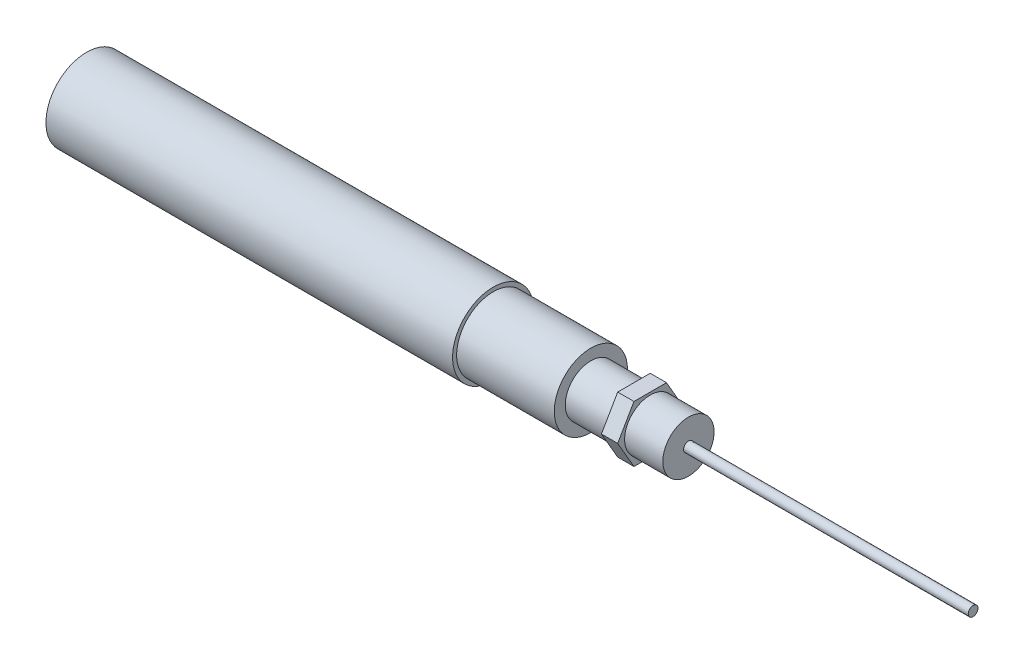
ISO-10303-21;
HEADER;
FILE_DESCRIPTION(('STEP AP214'),'2;1');
FILE_NAME('part.step','',(''),(''),'','','');
FILE_SCHEMA(('AUTOMOTIVE_DESIGN { 1 0 10303 214 1 1 1 1 }'));
ENDSEC;
DATA;
#1=APPLICATION_CONTEXT('core data for automotive mechanical design processes');
#2=APPLICATION_PROTOCOL_DEFINITION('international standard','automotive_design',2000,#1);
#3=PRODUCT_CONTEXT('',#1,'mechanical');
#4=PRODUCT('Part','Part','',(#3));
#5=PRODUCT_RELATED_PRODUCT_CATEGORY('part','',(#4));
#6=PRODUCT_DEFINITION_FORMATION('','',#4);
#7=PRODUCT_DEFINITION_CONTEXT('part definition',#1,'design');
#8=PRODUCT_DEFINITION('design','',#6,#7);
#9=PRODUCT_DEFINITION_SHAPE('','',#8);
#10=(LENGTH_UNIT() NAMED_UNIT(*) SI_UNIT(.MILLI.,.METRE.));
#11=(NAMED_UNIT(*) PLANE_ANGLE_UNIT() SI_UNIT($,.RADIAN.));
#12=(NAMED_UNIT(*) SI_UNIT($,.STERADIAN.) SOLID_ANGLE_UNIT());
#13=UNCERTAINTY_MEASURE_WITH_UNIT(LENGTH_MEASURE(1.E-05),#10,'distance_accuracy_value','');
#14=(GEOMETRIC_REPRESENTATION_CONTEXT(3) GLOBAL_UNCERTAINTY_ASSIGNED_CONTEXT((#13)) GLOBAL_UNIT_ASSIGNED_CONTEXT((#10,
#11,#12)) REPRESENTATION_CONTEXT('',''));
#15=CARTESIAN_POINT('',(0.,0.,0.));
#16=DIRECTION('',(0.,0.,1.));
#17=DIRECTION('',(1.,0.,0.));
#18=AXIS2_PLACEMENT_3D('',#15,#16,#17);
#19=CARTESIAN_POINT('',(45.,0.,0.));
#20=DIRECTION('',(-1.,0.,0.));
#21=DIRECTION('',(0.,0.,1.));
#22=AXIS2_PLACEMENT_3D('',#19,#20,#21);
#23=CYLINDRICAL_SURFACE('',#22,0.6);
#24=CARTESIAN_POINT('',(45.,0.,0.));
#25=DIRECTION('',(1.,0.,0.));
#26=DIRECTION('',(0.,0.,-1.));
#27=AXIS2_PLACEMENT_3D('',#24,#25,#26);
#28=CIRCLE('',#27,0.6);
#29=CARTESIAN_POINT('',(45.,0.,-0.6));
#30=VERTEX_POINT('',#29);
#31=EDGE_CURVE('E11',#30,#30,#28,.T.);
#32=ORIENTED_EDGE('',*,*,#31,.F.);
#33=EDGE_LOOP('',(#32));
#34=FACE_BOUND('',#33,.T.);
#35=CARTESIAN_POINT('',(10.,0.,0.));
#36=DIRECTION('',(1.,0.,0.));
#37=DIRECTION('',(0.,0.,-1.));
#38=AXIS2_PLACEMENT_3D('',#35,#36,#37);
#39=CIRCLE('',#38,0.6);
#40=CARTESIAN_POINT('',(10.,0.,-0.6));
#41=VERTEX_POINT('',#40);
#42=EDGE_CURVE('E60',#41,#41,#39,.T.);
#43=ORIENTED_EDGE('',*,*,#42,.T.);
#44=EDGE_LOOP('',(#43));
#45=FACE_BOUND('',#44,.T.);
#46=ADVANCED_FACE('F53',(#34,#45),#23,.T.);
#47=CARTESIAN_POINT('',(45.,0.,0.));
#48=DIRECTION('',(1.,0.,0.));
#49=DIRECTION('',(0.,0.,-1.));
#50=AXIS2_PLACEMENT_3D('',#47,#48,#49);
#51=PLANE('',#50);
#52=ORIENTED_EDGE('',*,*,#31,.T.);
#53=EDGE_LOOP('',(#52));
#54=FACE_BOUND('',#53,.T.);
#55=ADVANCED_FACE('F68',(#54),#51,.T.);
#56=CARTESIAN_POINT('',(10.,0.,0.));
#57=DIRECTION('',(1.,0.,0.));
#58=DIRECTION('',(0.,0.,-1.));
#59=AXIS2_PLACEMENT_3D('',#56,#57,#58);
#60=PLANE('',#59);
#61=ORIENTED_EDGE('',*,*,#42,.F.);
#62=EDGE_LOOP('',(#61));
#63=FACE_BOUND('',#62,.T.);
#64=ADVANCED_FACE('F70',(#63),#60,.F.);
#65=CLOSED_SHELL('',(#46,#55,#64));
#66=MANIFOLD_SOLID_BREP('B2',#65);
#67=CARTESIAN_POINT('',(-14.,0.,0.));
#68=DIRECTION('',(-1.,0.,0.));
#69=DIRECTION('',(0.,0.,1.));
#70=AXIS2_PLACEMENT_3D('',#67,#68,#69);
#71=CYLINDRICAL_SURFACE('',#70,5.);
#72=CARTESIAN_POINT('',(-14.,0.,0.));
#73=DIRECTION('',(1.,0.,0.));
#74=DIRECTION('',(0.,0.,-1.));
#75=AXIS2_PLACEMENT_3D('',#72,#73,#74);
#76=CIRCLE('',#75,5.);
#77=CARTESIAN_POINT('',(-14.,0.,-5.));
#78=VERTEX_POINT('',#77);
#79=EDGE_CURVE('E52',#78,#78,#76,.T.);
#80=ORIENTED_EDGE('',*,*,#79,.F.);
#81=EDGE_LOOP('',(#80));
#82=FACE_BOUND('',#81,.T.);
#83=CARTESIAN_POINT('',(-64.,0.,0.));
#84=DIRECTION('',(1.,0.,0.));
#85=DIRECTION('',(0.,0.,-1.));
#86=AXIS2_PLACEMENT_3D('',#83,#84,#85);
#87=CIRCLE('',#86,5.);
#88=CARTESIAN_POINT('',(-64.,0.,-5.));
#89=VERTEX_POINT('',#88);
#90=EDGE_CURVE('E120',#89,#89,#87,.T.);
#91=ORIENTED_EDGE('',*,*,#90,.T.);
#92=EDGE_LOOP('',(#91));
#93=FACE_BOUND('',#92,.T.);
#94=ADVANCED_FACE('F113',(#82,#93),#71,.T.);
#95=CARTESIAN_POINT('',(-14.,0.,0.));
#96=DIRECTION('',(1.,0.,0.));
#97=DIRECTION('',(0.,0.,-1.));
#98=AXIS2_PLACEMENT_3D('',#95,#96,#97);
#99=PLANE('',#98);
#100=ORIENTED_EDGE('',*,*,#79,.T.);
#101=EDGE_LOOP('',(#100));
#102=FACE_BOUND('',#101,.T.);
#103=ADVANCED_FACE('F128',(#102),#99,.T.);
#104=CARTESIAN_POINT('',(-64.,0.,0.));
#105=DIRECTION('',(1.,0.,0.));
#106=DIRECTION('',(0.,0.,-1.));
#107=AXIS2_PLACEMENT_3D('',#104,#105,#106);
#108=PLANE('',#107);
#109=ORIENTED_EDGE('',*,*,#90,.F.);
#110=EDGE_LOOP('',(#109));
#111=FACE_BOUND('',#110,.T.);
#112=ADVANCED_FACE('F126',(#111),#108,.F.);
#113=CLOSED_SHELL('',(#94,#103,#112));
#114=MANIFOLD_SOLID_BREP('B6',#113);
#115=CARTESIAN_POINT('',(-2.,0.,0.));
#116=DIRECTION('',(-1.,0.,0.));
#117=DIRECTION('',(0.,0.,1.));
#118=AXIS2_PLACEMENT_3D('',#115,#116,#117);
#119=CYLINDRICAL_SURFACE('',#118,4.5);
#120=CARTESIAN_POINT('',(-2.,0.,0.));
#121=DIRECTION('',(1.,0.,0.));
#122=DIRECTION('',(0.,0.,-1.));
#123=AXIS2_PLACEMENT_3D('',#120,#121,#122);
#124=CIRCLE('',#123,4.5);
#125=CARTESIAN_POINT('',(-2.,0.,-4.5));
#126=VERTEX_POINT('',#125);
#127=EDGE_CURVE('E111',#126,#126,#124,.T.);
#128=ORIENTED_EDGE('',*,*,#127,.F.);
#129=EDGE_LOOP('',(#128));
#130=FACE_BOUND('',#129,.T.);
#131=CARTESIAN_POINT('',(-14.,0.,0.));
#132=DIRECTION('',(1.,0.,0.));
#133=DIRECTION('',(0.,0.,-1.));
#134=AXIS2_PLACEMENT_3D('',#131,#132,#133);
#135=CIRCLE('',#134,4.5);
#136=CARTESIAN_POINT('',(-14.,0.,-4.5));
#137=VERTEX_POINT('',#136);
#138=EDGE_CURVE('E182',#137,#137,#135,.T.);
#139=ORIENTED_EDGE('',*,*,#138,.T.);
#140=EDGE_LOOP('',(#139));
#141=FACE_BOUND('',#140,.T.);
#142=ADVANCED_FACE('F177',(#130,#141),#119,.T.);
#143=CARTESIAN_POINT('',(-2.,0.,0.));
#144=DIRECTION('',(1.,0.,0.));
#145=DIRECTION('',(0.,0.,-1.));
#146=AXIS2_PLACEMENT_3D('',#143,#144,#145);
#147=PLANE('',#146);
#148=ORIENTED_EDGE('',*,*,#127,.T.);
#149=EDGE_LOOP('',(#148));
#150=FACE_BOUND('',#149,.T.);
#151=ADVANCED_FACE('F192',(#150),#147,.T.);
#152=CARTESIAN_POINT('',(-14.,0.,0.));
#153=DIRECTION('',(1.,0.,0.));
#154=DIRECTION('',(0.,0.,-1.));
#155=AXIS2_PLACEMENT_3D('',#152,#153,#154);
#156=PLANE('',#155);
#157=ORIENTED_EDGE('',*,*,#138,.F.);
#158=EDGE_LOOP('',(#157));
#159=FACE_BOUND('',#158,.T.);
#160=ADVANCED_FACE('F191',(#159),#156,.F.);
#161=CLOSED_SHELL('',(#142,#151,#160));
#162=MANIFOLD_SOLID_BREP('B48',#161);
#163=CARTESIAN_POINT('',(5.3,0.,0.));
#164=DIRECTION('',(1.,0.,0.));
#165=DIRECTION('',(0.,0.,-1.));
#166=AXIS2_PLACEMENT_3D('',#163,#164,#165);
#167=PLANE('',#166);
#168=DIRECTION('',(0.,0.866025403784441,-0.499999999999995));
#169=VECTOR('',#168,1.);
#170=CARTESIAN_POINT('',(5.3,-3.46410161513773,-2.00000000000004));
#171=LINE('',#170,#169);
#172=CARTESIAN_POINT('',(5.3,-3.46410161513773,-2.00000000000004));
#173=VERTEX_POINT('',#172);
#174=CARTESIAN_POINT('',(5.3,0.,-4.));
#175=VERTEX_POINT('',#174);
#176=EDGE_CURVE('E331',#173,#175,#171,.T.);
#177=ORIENTED_EDGE('',*,*,#176,.T.);
#178=DIRECTION('',(0.,0.866025403784438,0.500000000000001));
#179=VECTOR('',#178,1.);
#180=CARTESIAN_POINT('',(5.3,0.,-4.));
#181=LINE('',#180,#179);
#182=CARTESIAN_POINT('',(5.3,3.46410161513776,-1.99999999999999));
#183=VERTEX_POINT('',#182);
#184=EDGE_CURVE('E295',#175,#183,#181,.T.);
#185=ORIENTED_EDGE('',*,*,#184,.T.);
#186=DIRECTION('',(0.,0.,1.));
#187=VECTOR('',#186,1.);
#188=CARTESIAN_POINT('',(5.3,3.46410161513776,-1.99999999999999));
#189=LINE('',#188,#187);
#190=CARTESIAN_POINT('',(5.3,3.46410161513775,2.00000000000002));
#191=VERTEX_POINT('',#190);
#192=EDGE_CURVE('E304',#183,#191,#189,.T.);
#193=ORIENTED_EDGE('',*,*,#192,.T.);
#194=DIRECTION('',(0.,-0.866025403784442,0.499999999999995));
#195=VECTOR('',#194,1.);
#196=CARTESIAN_POINT('',(5.3,3.46410161513775,2.00000000000002));
#197=LINE('',#196,#195);
#198=CARTESIAN_POINT('',(5.3,0.,4.));
#199=VERTEX_POINT('',#198);
#200=EDGE_CURVE('E298',#191,#199,#197,.T.);
#201=ORIENTED_EDGE('',*,*,#200,.T.);
#202=DIRECTION('',(0.,-0.866025403784434,-0.500000000000007));
#203=VECTOR('',#202,1.);
#204=CARTESIAN_POINT('',(5.3,0.,4.));
#205=LINE('',#204,#203);
#206=CARTESIAN_POINT('',(5.3,-3.46410161513777,1.99999999999997));
#207=VERTEX_POINT('',#206);
#208=EDGE_CURVE('E302',#199,#207,#205,.T.);
#209=ORIENTED_EDGE('',*,*,#208,.T.);
#210=DIRECTION('',(0.,0.,-1.));
#211=VECTOR('',#210,1.);
#212=CARTESIAN_POINT('',(5.3,-3.46410161513777,1.99999999999997));
#213=LINE('',#212,#211);
#214=EDGE_CURVE('E254',#207,#173,#213,.T.);
#215=ORIENTED_EDGE('',*,*,#214,.T.);
#216=EDGE_LOOP('',(#177,#185,#193,#201,#209,#215));
#217=FACE_BOUND('',#216,.T.);
#218=CARTESIAN_POINT('',(5.3,0.,0.));
#219=DIRECTION('',(1.,0.,0.));
#220=DIRECTION('',(0.,0.,-1.));
#221=AXIS2_PLACEMENT_3D('',#218,#219,#220);
#222=CIRCLE('',#221,3.15);
#223=CARTESIAN_POINT('',(5.3,0.,-3.15));
#224=VERTEX_POINT('',#223);
#225=EDGE_CURVE('E330',#224,#224,#222,.T.);
#226=ORIENTED_EDGE('',*,*,#225,.F.);
#227=EDGE_LOOP('',(#226));
#228=FACE_BOUND('',#227,.T.);
#229=ADVANCED_FACE('F236',(#217,#228),#167,.T.);
#230=CARTESIAN_POINT('',(3.3,0.,0.));
#231=DIRECTION('',(1.,0.,0.));
#232=DIRECTION('',(0.,0.,-1.));
#233=AXIS2_PLACEMENT_3D('',#230,#231,#232);
#234=PLANE('',#233);
#235=DIRECTION('',(0.,0.866025403784441,-0.499999999999995));
#236=VECTOR('',#235,1.);
#237=CARTESIAN_POINT('',(3.3,-3.46410161513773,-2.00000000000004));
#238=LINE('',#237,#236);
#239=CARTESIAN_POINT('',(3.3,-3.46410161513773,-2.00000000000004));
#240=VERTEX_POINT('',#239);
#241=CARTESIAN_POINT('',(3.3,0.,-4.));
#242=VERTEX_POINT('',#241);
#243=EDGE_CURVE('E323',#240,#242,#238,.T.);
#244=ORIENTED_EDGE('',*,*,#243,.F.);
#245=DIRECTION('',(0.,0.,-1.));
#246=VECTOR('',#245,1.);
#247=CARTESIAN_POINT('',(3.3,-3.46410161513777,1.99999999999997));
#248=LINE('',#247,#246);
#249=CARTESIAN_POINT('',(3.3,-3.46410161513777,1.99999999999997));
#250=VERTEX_POINT('',#249);
#251=EDGE_CURVE('E283',#250,#240,#248,.T.);
#252=ORIENTED_EDGE('',*,*,#251,.F.);
#253=DIRECTION('',(0.,-0.866025403784434,-0.500000000000007));
#254=VECTOR('',#253,1.);
#255=CARTESIAN_POINT('',(3.3,0.,4.));
#256=LINE('',#255,#254);
#257=CARTESIAN_POINT('',(3.3,0.,4.));
#258=VERTEX_POINT('',#257);
#259=EDGE_CURVE('E279',#258,#250,#256,.T.);
#260=ORIENTED_EDGE('',*,*,#259,.F.);
#261=DIRECTION('',(0.,-0.866025403784442,0.499999999999995));
#262=VECTOR('',#261,1.);
#263=CARTESIAN_POINT('',(3.3,3.46410161513775,2.00000000000002));
#264=LINE('',#263,#262);
#265=CARTESIAN_POINT('',(3.3,3.46410161513775,2.00000000000002));
#266=VERTEX_POINT('',#265);
#267=EDGE_CURVE('E311',#266,#258,#264,.T.);
#268=ORIENTED_EDGE('',*,*,#267,.F.);
#269=DIRECTION('',(0.,0.,1.));
#270=VECTOR('',#269,1.);
#271=CARTESIAN_POINT('',(3.3,3.46410161513776,-1.99999999999999));
#272=LINE('',#271,#270);
#273=CARTESIAN_POINT('',(3.3,3.46410161513776,-1.99999999999999));
#274=VERTEX_POINT('',#273);
#275=EDGE_CURVE('E328',#274,#266,#272,.T.);
#276=ORIENTED_EDGE('',*,*,#275,.F.);
#277=DIRECTION('',(0.,0.866025403784438,0.500000000000001));
#278=VECTOR('',#277,1.);
#279=CARTESIAN_POINT('',(3.3,0.,-4.));
#280=LINE('',#279,#278);
#281=EDGE_CURVE('E326',#242,#274,#280,.T.);
#282=ORIENTED_EDGE('',*,*,#281,.F.);
#283=EDGE_LOOP('',(#244,#252,#260,#268,#276,#282));
#284=FACE_BOUND('',#283,.T.);
#285=CARTESIAN_POINT('',(3.3,0.,0.));
#286=DIRECTION('',(1.,0.,0.));
#287=DIRECTION('',(0.,0.,-1.));
#288=AXIS2_PLACEMENT_3D('',#285,#286,#287);
#289=CIRCLE('',#288,3.15);
#290=CARTESIAN_POINT('',(3.3,0.,-3.15));
#291=VERTEX_POINT('',#290);
#292=EDGE_CURVE('E465',#291,#291,#289,.T.);
#293=ORIENTED_EDGE('',*,*,#292,.T.);
#294=EDGE_LOOP('',(#293));
#295=FACE_BOUND('',#294,.T.);
#296=ADVANCED_FACE('F342',(#284,#295),#234,.F.);
#297=CARTESIAN_POINT('',(5.3,-3.46410161513773,-2.00000000000004));
#298=DIRECTION('',(0.,0.499999999999995,0.866025403784441));
#299=DIRECTION('',(0.,-0.866025403784441,0.499999999999995));
#300=AXIS2_PLACEMENT_3D('',#297,#298,#299);
#301=PLANE('',#300);
#302=ORIENTED_EDGE('',*,*,#243,.T.);
#303=DIRECTION('',(-1.,0.,0.));
#304=VECTOR('',#303,1.);
#305=CARTESIAN_POINT('',(5.3,0.,-4.));
#306=LINE('',#305,#304);
#307=EDGE_CURVE('E176',#175,#242,#306,.T.);
#308=ORIENTED_EDGE('',*,*,#307,.F.);
#309=ORIENTED_EDGE('',*,*,#176,.F.);
#310=DIRECTION('',(-1.,0.,0.));
#311=VECTOR('',#310,1.);
#312=CARTESIAN_POINT('',(5.3,-3.46410161513773,-2.00000000000004));
#313=LINE('',#312,#311);
#314=EDGE_CURVE('E317',#173,#240,#313,.T.);
#315=ORIENTED_EDGE('',*,*,#314,.T.);
#316=EDGE_LOOP('',(#302,#308,#309,#315));
#317=FACE_BOUND('',#316,.T.);
#318=ADVANCED_FACE('F238',(#317),#301,.F.);
#319=CARTESIAN_POINT('',(5.3,0.,-4.));
#320=DIRECTION('',(0.,-0.500000000000001,0.866025403784438));
#321=DIRECTION('',(0.,-0.866025403784438,-0.500000000000001));
#322=AXIS2_PLACEMENT_3D('',#319,#320,#321);
#323=PLANE('',#322);
#324=ORIENTED_EDGE('',*,*,#281,.T.);
#325=DIRECTION('',(-1.,0.,0.));
#326=VECTOR('',#325,1.);
#327=CARTESIAN_POINT('',(5.3,3.46410161513776,-1.99999999999999));
#328=LINE('',#327,#326);
#329=EDGE_CURVE('E250',#183,#274,#328,.T.);
#330=ORIENTED_EDGE('',*,*,#329,.F.);
#331=ORIENTED_EDGE('',*,*,#184,.F.);
#332=ORIENTED_EDGE('',*,*,#307,.T.);
#333=EDGE_LOOP('',(#324,#330,#331,#332));
#334=FACE_BOUND('',#333,.T.);
#335=ADVANCED_FACE('F366',(#334),#323,.F.);
#336=CARTESIAN_POINT('',(5.3,3.46410161513776,-1.99999999999999));
#337=DIRECTION('',(0.,-1.,0.));
#338=DIRECTION('',(0.,0.,-1.));
#339=AXIS2_PLACEMENT_3D('',#336,#337,#338);
#340=PLANE('',#339);
#341=ORIENTED_EDGE('',*,*,#275,.T.);
#342=DIRECTION('',(-1.,0.,0.));
#343=VECTOR('',#342,1.);
#344=CARTESIAN_POINT('',(5.3,3.46410161513775,2.00000000000002));
#345=LINE('',#344,#343);
#346=EDGE_CURVE('E314',#191,#266,#345,.T.);
#347=ORIENTED_EDGE('',*,*,#346,.F.);
#348=ORIENTED_EDGE('',*,*,#192,.F.);
#349=ORIENTED_EDGE('',*,*,#329,.T.);
#350=EDGE_LOOP('',(#341,#347,#348,#349));
#351=FACE_BOUND('',#350,.T.);
#352=ADVANCED_FACE('F337',(#351),#340,.F.);
#353=CARTESIAN_POINT('',(5.3,3.46410161513775,2.00000000000002));
#354=DIRECTION('',(0.,-0.499999999999995,-0.866025403784442));
#355=DIRECTION('',(0.,0.866025403784442,-0.499999999999995));
#356=AXIS2_PLACEMENT_3D('',#353,#354,#355);
#357=PLANE('',#356);
#358=ORIENTED_EDGE('',*,*,#267,.T.);
#359=DIRECTION('',(-1.,0.,0.));
#360=VECTOR('',#359,1.);
#361=CARTESIAN_POINT('',(5.3,0.,4.));
#362=LINE('',#361,#360);
#363=EDGE_CURVE('E309',#199,#258,#362,.T.);
#364=ORIENTED_EDGE('',*,*,#363,.F.);
#365=ORIENTED_EDGE('',*,*,#200,.F.);
#366=ORIENTED_EDGE('',*,*,#346,.T.);
#367=EDGE_LOOP('',(#358,#364,#365,#366));
#368=FACE_BOUND('',#367,.T.);
#369=ADVANCED_FACE('F313',(#368),#357,.F.);
#370=CARTESIAN_POINT('',(5.3,0.,4.));
#371=DIRECTION('',(0.,0.500000000000007,-0.866025403784435));
#372=DIRECTION('',(0.,0.866025403784434,0.500000000000007));
#373=AXIS2_PLACEMENT_3D('',#370,#371,#372);
#374=PLANE('',#373);
#375=ORIENTED_EDGE('',*,*,#259,.T.);
#376=DIRECTION('',(-1.,0.,0.));
#377=VECTOR('',#376,1.);
#378=CARTESIAN_POINT('',(5.3,-3.46410161513777,1.99999999999997));
#379=LINE('',#378,#377);
#380=EDGE_CURVE('E312',#207,#250,#379,.T.);
#381=ORIENTED_EDGE('',*,*,#380,.F.);
#382=ORIENTED_EDGE('',*,*,#208,.F.);
#383=ORIENTED_EDGE('',*,*,#363,.T.);
#384=EDGE_LOOP('',(#375,#381,#382,#383));
#385=FACE_BOUND('',#384,.T.);
#386=ADVANCED_FACE('F320',(#385),#374,.F.);
#387=CARTESIAN_POINT('',(5.3,-3.46410161513777,1.99999999999997));
#388=DIRECTION('',(0.,1.,0.));
#389=DIRECTION('',(0.,0.,1.));
#390=AXIS2_PLACEMENT_3D('',#387,#388,#389);
#391=PLANE('',#390);
#392=ORIENTED_EDGE('',*,*,#251,.T.);
#393=ORIENTED_EDGE('',*,*,#314,.F.);
#394=ORIENTED_EDGE('',*,*,#214,.F.);
#395=ORIENTED_EDGE('',*,*,#380,.T.);
#396=EDGE_LOOP('',(#392,#393,#394,#395));
#397=FACE_BOUND('',#396,.T.);
#398=ADVANCED_FACE('F346',(#397),#391,.F.);
#399=CARTESIAN_POINT('',(5.3,0.,0.));
#400=DIRECTION('',(-1.,0.,0.));
#401=DIRECTION('',(0.,0.,1.));
#402=AXIS2_PLACEMENT_3D('',#399,#400,#401);
#403=CYLINDRICAL_SURFACE('',#402,3.15);
#404=ORIENTED_EDGE('',*,*,#225,.T.);
#405=EDGE_LOOP('',(#404));
#406=FACE_BOUND('',#405,.T.);
#407=ORIENTED_EDGE('',*,*,#292,.F.);
#408=EDGE_LOOP('',(#407));
#409=FACE_BOUND('',#408,.T.);
#410=ADVANCED_FACE('F348',(#406,#409),#403,.F.);
#411=CLOSED_SHELL('',(#229,#296,#318,#335,#352,#369,#386,#398,#410));
#412=MANIFOLD_SOLID_BREP('B108',#411);
#413=CARTESIAN_POINT('',(10.,0.,0.));
#414=DIRECTION('',(-1.,0.,0.));
#415=DIRECTION('',(0.,0.,1.));
#416=AXIS2_PLACEMENT_3D('',#413,#414,#415);
#417=CYLINDRICAL_SURFACE('',#416,3.15);
#418=CARTESIAN_POINT('',(10.,0.,0.));
#419=DIRECTION('',(1.,0.,0.));
#420=DIRECTION('',(0.,0.,-1.));
#421=AXIS2_PLACEMENT_3D('',#418,#419,#420);
#422=CIRCLE('',#421,3.15);
#423=CARTESIAN_POINT('',(10.,0.,-3.15));
#424=VERTEX_POINT('',#423);
#425=EDGE_CURVE('E240',#424,#424,#422,.T.);
#426=ORIENTED_EDGE('',*,*,#425,.F.);
#427=EDGE_LOOP('',(#426));
#428=FACE_BOUND('',#427,.T.);
#429=CARTESIAN_POINT('',(-2.,0.,0.));
#430=DIRECTION('',(1.,0.,0.));
#431=DIRECTION('',(0.,0.,-1.));
#432=AXIS2_PLACEMENT_3D('',#429,#430,#431);
#433=CIRCLE('',#432,3.15);
#434=CARTESIAN_POINT('',(-2.,0.,-3.15));
#435=VERTEX_POINT('',#434);
#436=EDGE_CURVE('E475',#435,#435,#433,.T.);
#437=ORIENTED_EDGE('',*,*,#436,.T.);
#438=EDGE_LOOP('',(#437));
#439=FACE_BOUND('',#438,.T.);
#440=ADVANCED_FACE('F473',(#428,#439),#417,.T.);
#441=CARTESIAN_POINT('',(10.,0.,0.));
#442=DIRECTION('',(1.,0.,0.));
#443=DIRECTION('',(0.,0.,-1.));
#444=AXIS2_PLACEMENT_3D('',#441,#442,#443);
#445=PLANE('',#444);
#446=ORIENTED_EDGE('',*,*,#425,.T.);
#447=EDGE_LOOP('',(#446));
#448=FACE_BOUND('',#447,.T.);
#449=ADVANCED_FACE('F486',(#448),#445,.T.);
#450=CARTESIAN_POINT('',(-2.,0.,0.));
#451=DIRECTION('',(1.,0.,0.));
#452=DIRECTION('',(0.,0.,-1.));
#453=AXIS2_PLACEMENT_3D('',#450,#451,#452);
#454=PLANE('',#453);
#455=ORIENTED_EDGE('',*,*,#436,.F.);
#456=EDGE_LOOP('',(#455));
#457=FACE_BOUND('',#456,.T.);
#458=ADVANCED_FACE('F482',(#457),#454,.F.);
#459=CLOSED_SHELL('',(#440,#449,#458));
#460=MANIFOLD_SOLID_BREP('B168',#459);
#461=ADVANCED_BREP_SHAPE_REPRESENTATION('',(#18,#66,#114,#162,#412,#460),#14);
#462=SHAPE_DEFINITION_REPRESENTATION(#9,#461);
ENDSEC;
END-ISO-10303-21;
